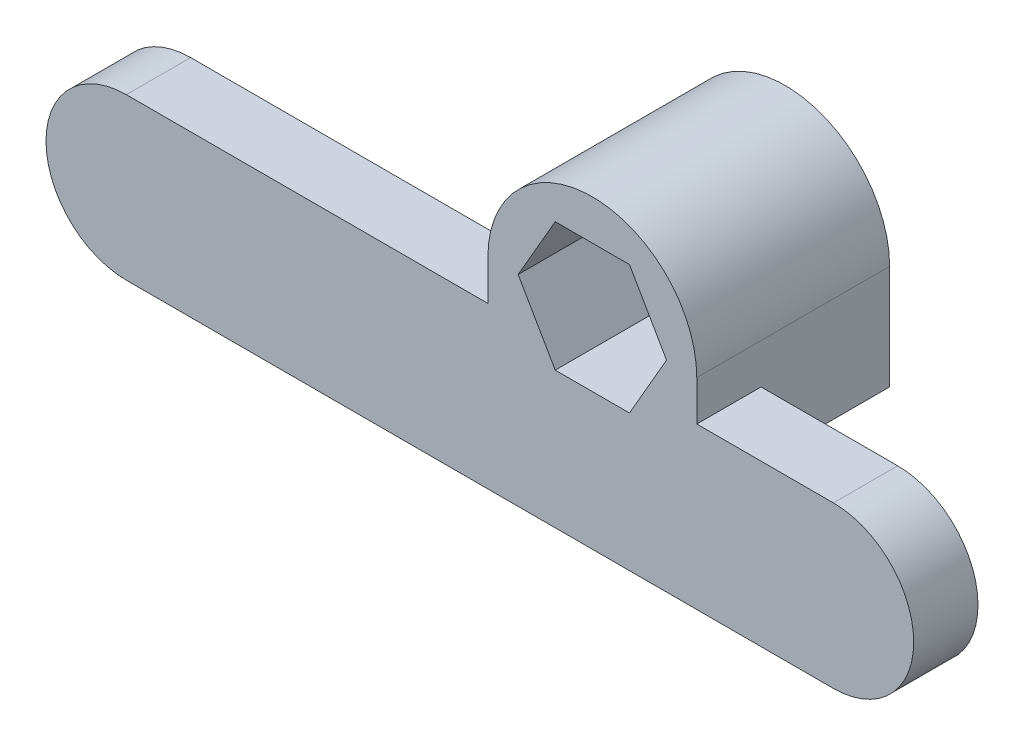
ISO-10303-21;
HEADER;
FILE_DESCRIPTION(('STEP AP214'),'2;1');
FILE_NAME('part.step','',(''),(''),'','','');
FILE_SCHEMA(('AUTOMOTIVE_DESIGN { 1 0 10303 214 1 1 1 1 }'));
ENDSEC;
DATA;
#1=APPLICATION_CONTEXT('core data for automotive mechanical design processes');
#2=APPLICATION_PROTOCOL_DEFINITION('international standard','automotive_design',2000,#1);
#3=PRODUCT_CONTEXT('',#1,'mechanical');
#4=PRODUCT('Part','Part','',(#3));
#5=PRODUCT_RELATED_PRODUCT_CATEGORY('part','',(#4));
#6=PRODUCT_DEFINITION_FORMATION('','',#4);
#7=PRODUCT_DEFINITION_CONTEXT('part definition',#1,'design');
#8=PRODUCT_DEFINITION('design','',#6,#7);
#9=PRODUCT_DEFINITION_SHAPE('','',#8);
#10=(LENGTH_UNIT() NAMED_UNIT(*) SI_UNIT(.MILLI.,.METRE.));
#11=(NAMED_UNIT(*) PLANE_ANGLE_UNIT() SI_UNIT($,.RADIAN.));
#12=(NAMED_UNIT(*) SI_UNIT($,.STERADIAN.) SOLID_ANGLE_UNIT());
#13=UNCERTAINTY_MEASURE_WITH_UNIT(LENGTH_MEASURE(1.E-05),#10,'distance_accuracy_value','');
#14=(GEOMETRIC_REPRESENTATION_CONTEXT(3) GLOBAL_UNCERTAINTY_ASSIGNED_CONTEXT((#13)) GLOBAL_UNIT_ASSIGNED_CONTEXT((#10,
#11,#12)) REPRESENTATION_CONTEXT('',''));
#15=CARTESIAN_POINT('',(0.,0.,0.));
#16=DIRECTION('',(0.,0.,1.));
#17=DIRECTION('',(1.,0.,0.));
#18=AXIS2_PLACEMENT_3D('',#15,#16,#17);
#19=CARTESIAN_POINT('',(0.,0.,6.));
#20=DIRECTION('',(0.,0.,-1.));
#21=DIRECTION('',(-1.,0.,0.));
#22=AXIS2_PLACEMENT_3D('',#19,#20,#21);
#23=CYLINDRICAL_SURFACE('',#22,1.25);
#24=CARTESIAN_POINT('',(0.,0.,2.));
#25=DIRECTION('',(0.,0.,1.));
#26=DIRECTION('',(1.,0.,0.));
#27=AXIS2_PLACEMENT_3D('',#24,#25,#26);
#28=CIRCLE('',#27,1.25);
#29=CARTESIAN_POINT('',(1.25,0.,2.));
#30=VERTEX_POINT('',#29);
#31=EDGE_CURVE('E313',#30,#30,#28,.T.);
#32=ORIENTED_EDGE('',*,*,#31,.F.);
#33=EDGE_LOOP('',(#32));
#34=FACE_BOUND('',#33,.T.);
#35=CARTESIAN_POINT('',(0.,0.,4.));
#36=DIRECTION('',(0.,0.,1.));
#37=DIRECTION('',(1.,0.,0.));
#38=AXIS2_PLACEMENT_3D('',#35,#36,#37);
#39=CIRCLE('',#38,1.25);
#40=CARTESIAN_POINT('',(1.25,0.,4.));
#41=VERTEX_POINT('',#40);
#42=EDGE_CURVE('E96',#41,#41,#39,.T.);
#43=ORIENTED_EDGE('',*,*,#42,.T.);
#44=EDGE_LOOP('',(#43));
#45=FACE_BOUND('',#44,.T.);
#46=ADVANCED_FACE('F92',(#34,#45),#23,.F.);
#47=CARTESIAN_POINT('',(0.,0.,2.));
#48=DIRECTION('',(0.,0.,1.));
#49=DIRECTION('',(1.,0.,0.));
#50=AXIS2_PLACEMENT_3D('',#47,#48,#49);
#51=PLANE('',#50);
#52=DIRECTION('',(0.,-1.,0.));
#53=VECTOR('',#52,1.);
#54=CARTESIAN_POINT('',(-1.05,-3.25,2.));
#55=LINE('',#54,#53);
#56=CARTESIAN_POINT('',(-1.05,-3.25,2.));
#57=VERTEX_POINT('',#56);
#58=CARTESIAN_POINT('',(-1.05,-6.25,2.));
#59=VERTEX_POINT('',#58);
#60=EDGE_CURVE('E331',#57,#59,#55,.T.);
#61=ORIENTED_EDGE('',*,*,#60,.F.);
#62=DIRECTION('',(1.,0.,0.));
#63=VECTOR('',#62,1.);
#64=CARTESIAN_POINT('',(-3.25,-3.25,2.));
#65=LINE('',#64,#63);
#66=CARTESIAN_POINT('',(-3.25,-3.25,2.));
#67=VERTEX_POINT('',#66);
#68=EDGE_CURVE('E336',#67,#57,#65,.T.);
#69=ORIENTED_EDGE('',*,*,#68,.F.);
#70=DIRECTION('',(0.,-1.,0.));
#71=VECTOR('',#70,1.);
#72=CARTESIAN_POINT('',(-3.25,0.,2.));
#73=LINE('',#72,#71);
#74=CARTESIAN_POINT('',(-3.25,0.,2.));
#75=VERTEX_POINT('',#74);
#76=EDGE_CURVE('E361',#75,#67,#73,.T.);
#77=ORIENTED_EDGE('',*,*,#76,.F.);
#78=CARTESIAN_POINT('',(0.,0.,2.));
#79=DIRECTION('',(0.,0.,1.));
#80=DIRECTION('',(1.,0.,0.));
#81=AXIS2_PLACEMENT_3D('',#78,#79,#80);
#82=CIRCLE('',#81,3.25);
#83=CARTESIAN_POINT('',(3.25,0.,2.));
#84=VERTEX_POINT('',#83);
#85=EDGE_CURVE('E359',#84,#75,#82,.T.);
#86=ORIENTED_EDGE('',*,*,#85,.F.);
#87=DIRECTION('',(0.,1.,0.));
#88=VECTOR('',#87,1.);
#89=CARTESIAN_POINT('',(3.25,0.,2.));
#90=LINE('',#89,#88);
#91=CARTESIAN_POINT('',(3.25,-3.25,2.));
#92=VERTEX_POINT('',#91);
#93=EDGE_CURVE('E357',#92,#84,#90,.T.);
#94=ORIENTED_EDGE('',*,*,#93,.F.);
#95=DIRECTION('',(1.,0.,0.));
#96=VECTOR('',#95,1.);
#97=CARTESIAN_POINT('',(1.05,-3.25,2.));
#98=LINE('',#97,#96);
#99=CARTESIAN_POINT('',(1.05,-3.25,2.));
#100=VERTEX_POINT('',#99);
#101=EDGE_CURVE('E355',#100,#92,#98,.T.);
#102=ORIENTED_EDGE('',*,*,#101,.F.);
#103=DIRECTION('',(0.,1.,0.));
#104=VECTOR('',#103,1.);
#105=CARTESIAN_POINT('',(1.05,-3.25,2.));
#106=LINE('',#105,#104);
#107=CARTESIAN_POINT('',(1.05,-6.25,2.));
#108=VERTEX_POINT('',#107);
#109=EDGE_CURVE('E353',#108,#100,#106,.T.);
#110=ORIENTED_EDGE('',*,*,#109,.F.);
#111=DIRECTION('',(1.,0.,0.));
#112=VECTOR('',#111,1.);
#113=CARTESIAN_POINT('',(-1.05,-6.25,2.));
#114=LINE('',#113,#112);
#115=EDGE_CURVE('E351',#59,#108,#114,.T.);
#116=ORIENTED_EDGE('',*,*,#115,.F.);
#117=EDGE_LOOP('',(#61,#69,#77,#86,#94,#102,#110,#116));
#118=FACE_BOUND('',#117,.T.);
#119=ORIENTED_EDGE('',*,*,#31,.T.);
#120=EDGE_LOOP('',(#119));
#121=FACE_BOUND('',#120,.T.);
#122=ADVANCED_FACE('F391',(#118,#121),#51,.F.);
#123=CARTESIAN_POINT('',(-1.05,-3.25,6.));
#124=DIRECTION('',(1.,0.,0.));
#125=DIRECTION('',(0.,1.,0.));
#126=AXIS2_PLACEMENT_3D('',#123,#124,#125);
#127=PLANE('',#126);
#128=ORIENTED_EDGE('',*,*,#60,.T.);
#129=DIRECTION('',(0.,0.,-1.));
#130=VECTOR('',#129,1.);
#131=CARTESIAN_POINT('',(-1.05,-6.25,6.));
#132=LINE('',#131,#130);
#133=CARTESIAN_POINT('',(-1.05,-6.25,6.));
#134=VERTEX_POINT('',#133);
#135=EDGE_CURVE('E13',#134,#59,#132,.T.);
#136=ORIENTED_EDGE('',*,*,#135,.F.);
#137=DIRECTION('',(0.,-1.,0.));
#138=VECTOR('',#137,1.);
#139=CARTESIAN_POINT('',(-1.05,-3.25,6.));
#140=LINE('',#139,#138);
#141=CARTESIAN_POINT('',(-1.05,-3.25,6.));
#142=VERTEX_POINT('',#141);
#143=EDGE_CURVE('E332',#142,#134,#140,.T.);
#144=ORIENTED_EDGE('',*,*,#143,.F.);
#145=DIRECTION('',(0.,0.,-1.));
#146=VECTOR('',#145,1.);
#147=CARTESIAN_POINT('',(-1.05,-3.25,6.));
#148=LINE('',#147,#146);
#149=EDGE_CURVE('E348',#142,#57,#148,.T.);
#150=ORIENTED_EDGE('',*,*,#149,.T.);
#151=EDGE_LOOP('',(#128,#136,#144,#150));
#152=FACE_BOUND('',#151,.T.);
#153=ADVANCED_FACE('F94',(#152),#127,.F.);
#154=CARTESIAN_POINT('',(-1.05,-6.25,6.));
#155=DIRECTION('',(0.,1.,0.));
#156=DIRECTION('',(0.,0.,1.));
#157=AXIS2_PLACEMENT_3D('',#154,#155,#156);
#158=PLANE('',#157);
#159=ORIENTED_EDGE('',*,*,#115,.T.);
#160=DIRECTION('',(0.,0.,-1.));
#161=VECTOR('',#160,1.);
#162=CARTESIAN_POINT('',(1.05,-6.25,6.));
#163=LINE('',#162,#161);
#164=CARTESIAN_POINT('',(1.05,-6.25,6.));
#165=VERTEX_POINT('',#164);
#166=EDGE_CURVE('E101',#165,#108,#163,.T.);
#167=ORIENTED_EDGE('',*,*,#166,.F.);
#168=DIRECTION('',(1.,0.,0.));
#169=VECTOR('',#168,1.);
#170=CARTESIAN_POINT('',(0.,-6.25,6.));
#171=LINE('',#170,#169);
#172=CARTESIAN_POINT('',(7.5,-6.25,6.));
#173=VERTEX_POINT('',#172);
#174=EDGE_CURVE('E297',#165,#173,#171,.T.);
#175=ORIENTED_EDGE('',*,*,#174,.T.);
#176=DIRECTION('',(0.,0.,-1.));
#177=VECTOR('',#176,1.);
#178=CARTESIAN_POINT('',(7.5,-6.25,8.));
#179=LINE('',#178,#177);
#180=CARTESIAN_POINT('',(7.5,-6.25,8.));
#181=VERTEX_POINT('',#180);
#182=EDGE_CURVE('E305',#181,#173,#179,.T.);
#183=ORIENTED_EDGE('',*,*,#182,.F.);
#184=DIRECTION('',(1.,0.,0.));
#185=VECTOR('',#184,1.);
#186=CARTESIAN_POINT('',(0.,-6.25,8.));
#187=LINE('',#186,#185);
#188=CARTESIAN_POINT('',(-14.5,-6.25,8.));
#189=VERTEX_POINT('',#188);
#190=EDGE_CURVE('E289',#189,#181,#187,.T.);
#191=ORIENTED_EDGE('',*,*,#190,.F.);
#192=DIRECTION('',(0.,0.,-1.));
#193=VECTOR('',#192,1.);
#194=CARTESIAN_POINT('',(-14.5,-6.25,8.));
#195=LINE('',#194,#193);
#196=CARTESIAN_POINT('',(-14.5,-6.25,6.));
#197=VERTEX_POINT('',#196);
#198=EDGE_CURVE('E320',#189,#197,#195,.T.);
#199=ORIENTED_EDGE('',*,*,#198,.T.);
#200=EDGE_CURVE('E299',#197,#134,#171,.T.);
#201=ORIENTED_EDGE('',*,*,#200,.T.);
#202=ORIENTED_EDGE('',*,*,#135,.T.);
#203=EDGE_LOOP('',(#159,#167,#175,#183,#191,#199,#201,#202));
#204=FACE_BOUND('',#203,.T.);
#205=ADVANCED_FACE('F407',(#204),#158,.F.);
#206=CARTESIAN_POINT('',(1.05,-3.25,6.));
#207=DIRECTION('',(-1.,0.,0.));
#208=DIRECTION('',(0.,-1.,0.));
#209=AXIS2_PLACEMENT_3D('',#206,#207,#208);
#210=PLANE('',#209);
#211=ORIENTED_EDGE('',*,*,#109,.T.);
#212=DIRECTION('',(0.,0.,-1.));
#213=VECTOR('',#212,1.);
#214=CARTESIAN_POINT('',(1.05,-3.25,6.));
#215=LINE('',#214,#213);
#216=CARTESIAN_POINT('',(1.05,-3.25,6.));
#217=VERTEX_POINT('',#216);
#218=EDGE_CURVE('E378',#217,#100,#215,.T.);
#219=ORIENTED_EDGE('',*,*,#218,.F.);
#220=DIRECTION('',(0.,1.,0.));
#221=VECTOR('',#220,1.);
#222=CARTESIAN_POINT('',(1.05,-3.25,6.));
#223=LINE('',#222,#221);
#224=EDGE_CURVE('E335',#165,#217,#223,.T.);
#225=ORIENTED_EDGE('',*,*,#224,.F.);
#226=ORIENTED_EDGE('',*,*,#166,.T.);
#227=EDGE_LOOP('',(#211,#219,#225,#226));
#228=FACE_BOUND('',#227,.T.);
#229=ADVANCED_FACE('F385',(#228),#210,.F.);
#230=CARTESIAN_POINT('',(1.05,-3.25,6.));
#231=DIRECTION('',(0.,1.,0.));
#232=DIRECTION('',(0.,0.,1.));
#233=AXIS2_PLACEMENT_3D('',#230,#231,#232);
#234=PLANE('',#233);
#235=ORIENTED_EDGE('',*,*,#101,.T.);
#236=DIRECTION('',(0.,0.,-1.));
#237=VECTOR('',#236,1.);
#238=CARTESIAN_POINT('',(3.25,-3.25,6.));
#239=LINE('',#238,#237);
#240=CARTESIAN_POINT('',(3.25,-3.25,6.));
#241=VERTEX_POINT('',#240);
#242=EDGE_CURVE('E375',#241,#92,#239,.T.);
#243=ORIENTED_EDGE('',*,*,#242,.F.);
#244=DIRECTION('',(1.,0.,0.));
#245=VECTOR('',#244,1.);
#246=CARTESIAN_POINT('',(1.05,-3.25,6.));
#247=LINE('',#246,#245);
#248=EDGE_CURVE('E339',#217,#241,#247,.T.);
#249=ORIENTED_EDGE('',*,*,#248,.F.);
#250=ORIENTED_EDGE('',*,*,#218,.T.);
#251=EDGE_LOOP('',(#235,#243,#249,#250));
#252=FACE_BOUND('',#251,.T.);
#253=ADVANCED_FACE('F396',(#252),#234,.F.);
#254=CARTESIAN_POINT('',(3.25,0.,6.));
#255=DIRECTION('',(-1.,0.,0.));
#256=DIRECTION('',(0.,0.,1.));
#257=AXIS2_PLACEMENT_3D('',#254,#255,#256);
#258=PLANE('',#257);
#259=ORIENTED_EDGE('',*,*,#93,.T.);
#260=DIRECTION('',(0.,0.,-1.));
#261=VECTOR('',#260,1.);
#262=CARTESIAN_POINT('',(3.25,0.,6.));
#263=LINE('',#262,#261);
#264=CARTESIAN_POINT('',(3.25,0.,8.));
#265=VERTEX_POINT('',#264);
#266=EDGE_CURVE('E372',#265,#84,#263,.T.);
#267=ORIENTED_EDGE('',*,*,#266,.F.);
#268=DIRECTION('',(0.,1.,0.));
#269=VECTOR('',#268,1.);
#270=CARTESIAN_POINT('',(3.25,0.,8.));
#271=LINE('',#270,#269);
#272=CARTESIAN_POINT('',(3.25,-1.25,8.));
#273=VERTEX_POINT('',#272);
#274=EDGE_CURVE('E279',#273,#265,#271,.T.);
#275=ORIENTED_EDGE('',*,*,#274,.F.);
#276=DIRECTION('',(0.,0.,-1.));
#277=VECTOR('',#276,1.);
#278=CARTESIAN_POINT('',(3.25,-1.25,8.));
#279=LINE('',#278,#277);
#280=CARTESIAN_POINT('',(3.25,-1.25,6.));
#281=VERTEX_POINT('',#280);
#282=EDGE_CURVE('E308',#273,#281,#279,.T.);
#283=ORIENTED_EDGE('',*,*,#282,.T.);
#284=DIRECTION('',(0.,1.,0.));
#285=VECTOR('',#284,1.);
#286=CARTESIAN_POINT('',(3.25,0.,6.));
#287=LINE('',#286,#285);
#288=EDGE_CURVE('E342',#241,#281,#287,.T.);
#289=ORIENTED_EDGE('',*,*,#288,.F.);
#290=ORIENTED_EDGE('',*,*,#242,.T.);
#291=EDGE_LOOP('',(#259,#267,#275,#283,#289,#290));
#292=FACE_BOUND('',#291,.T.);
#293=ADVANCED_FACE('F400',(#292),#258,.F.);
#294=CARTESIAN_POINT('',(0.,0.,6.));
#295=DIRECTION('',(0.,0.,-1.));
#296=DIRECTION('',(-1.,0.,0.));
#297=AXIS2_PLACEMENT_3D('',#294,#295,#296);
#298=CYLINDRICAL_SURFACE('',#297,3.25);
#299=ORIENTED_EDGE('',*,*,#85,.T.);
#300=DIRECTION('',(0.,0.,-1.));
#301=VECTOR('',#300,1.);
#302=CARTESIAN_POINT('',(-3.25,0.,6.));
#303=LINE('',#302,#301);
#304=CARTESIAN_POINT('',(-3.25,0.,8.));
#305=VERTEX_POINT('',#304);
#306=EDGE_CURVE('E369',#305,#75,#303,.T.);
#307=ORIENTED_EDGE('',*,*,#306,.F.);
#308=CARTESIAN_POINT('',(0.,0.,8.));
#309=DIRECTION('',(0.,0.,1.));
#310=DIRECTION('',(1.,0.,0.));
#311=AXIS2_PLACEMENT_3D('',#308,#309,#310);
#312=CIRCLE('',#311,3.25);
#313=EDGE_CURVE('E283',#265,#305,#312,.T.);
#314=ORIENTED_EDGE('',*,*,#313,.F.);
#315=ORIENTED_EDGE('',*,*,#266,.T.);
#316=EDGE_LOOP('',(#299,#307,#314,#315));
#317=FACE_BOUND('',#316,.T.);
#318=ADVANCED_FACE('F433',(#317),#298,.T.);
#319=CARTESIAN_POINT('',(-3.25,0.,6.));
#320=DIRECTION('',(1.,0.,0.));
#321=DIRECTION('',(0.,1.,0.));
#322=AXIS2_PLACEMENT_3D('',#319,#320,#321);
#323=PLANE('',#322);
#324=ORIENTED_EDGE('',*,*,#76,.T.);
#325=DIRECTION('',(0.,0.,-1.));
#326=VECTOR('',#325,1.);
#327=CARTESIAN_POINT('',(-3.25,-3.25,6.));
#328=LINE('',#327,#326);
#329=CARTESIAN_POINT('',(-3.25,-3.25,6.));
#330=VERTEX_POINT('',#329);
#331=EDGE_CURVE('E366',#330,#67,#328,.T.);
#332=ORIENTED_EDGE('',*,*,#331,.F.);
#333=DIRECTION('',(0.,-1.,0.));
#334=VECTOR('',#333,1.);
#335=CARTESIAN_POINT('',(-3.25,0.,6.));
#336=LINE('',#335,#334);
#337=CARTESIAN_POINT('',(-3.25,-1.25,6.));
#338=VERTEX_POINT('',#337);
#339=EDGE_CURVE('E116',#338,#330,#336,.T.);
#340=ORIENTED_EDGE('',*,*,#339,.F.);
#341=DIRECTION('',(0.,0.,-1.));
#342=VECTOR('',#341,1.);
#343=CARTESIAN_POINT('',(-3.25,-1.25,8.));
#344=LINE('',#343,#342);
#345=CARTESIAN_POINT('',(-3.25,-1.25,8.));
#346=VERTEX_POINT('',#345);
#347=EDGE_CURVE('E311',#346,#338,#344,.T.);
#348=ORIENTED_EDGE('',*,*,#347,.F.);
#349=DIRECTION('',(0.,-1.,0.));
#350=VECTOR('',#349,1.);
#351=CARTESIAN_POINT('',(-3.25,0.,8.));
#352=LINE('',#351,#350);
#353=EDGE_CURVE('E286',#305,#346,#352,.T.);
#354=ORIENTED_EDGE('',*,*,#353,.F.);
#355=ORIENTED_EDGE('',*,*,#306,.T.);
#356=EDGE_LOOP('',(#324,#332,#340,#348,#354,#355));
#357=FACE_BOUND('',#356,.T.);
#358=ADVANCED_FACE('F429',(#357),#323,.F.);
#359=CARTESIAN_POINT('',(-3.25,-3.25,6.));
#360=DIRECTION('',(0.,1.,0.));
#361=DIRECTION('',(0.,0.,1.));
#362=AXIS2_PLACEMENT_3D('',#359,#360,#361);
#363=PLANE('',#362);
#364=ORIENTED_EDGE('',*,*,#68,.T.);
#365=ORIENTED_EDGE('',*,*,#149,.F.);
#366=DIRECTION('',(1.,0.,0.));
#367=VECTOR('',#366,1.);
#368=CARTESIAN_POINT('',(-3.25,-3.25,6.));
#369=LINE('',#368,#367);
#370=EDGE_CURVE('E345',#330,#142,#369,.T.);
#371=ORIENTED_EDGE('',*,*,#370,.F.);
#372=ORIENTED_EDGE('',*,*,#331,.T.);
#373=EDGE_LOOP('',(#364,#365,#371,#372));
#374=FACE_BOUND('',#373,.T.);
#375=ADVANCED_FACE('F426',(#374),#363,.F.);
#376=CARTESIAN_POINT('',(0.,0.,6.));
#377=DIRECTION('',(0.,0.,1.));
#378=DIRECTION('',(1.,0.,0.));
#379=AXIS2_PLACEMENT_3D('',#376,#377,#378);
#380=PLANE('',#379);
#381=ORIENTED_EDGE('',*,*,#174,.F.);
#382=ORIENTED_EDGE('',*,*,#224,.T.);
#383=ORIENTED_EDGE('',*,*,#248,.T.);
#384=ORIENTED_EDGE('',*,*,#288,.T.);
#385=DIRECTION('',(-1.,0.,0.));
#386=VECTOR('',#385,1.);
#387=CARTESIAN_POINT('',(0.,-1.25,6.));
#388=LINE('',#387,#386);
#389=CARTESIAN_POINT('',(7.5,-1.25,6.));
#390=VERTEX_POINT('',#389);
#391=EDGE_CURVE('E294',#390,#281,#388,.T.);
#392=ORIENTED_EDGE('',*,*,#391,.F.);
#393=CARTESIAN_POINT('',(7.5,-3.75,6.));
#394=DIRECTION('',(0.,0.,1.));
#395=DIRECTION('',(1.,0.,0.));
#396=AXIS2_PLACEMENT_3D('',#393,#394,#395);
#397=CIRCLE('',#396,2.5);
#398=EDGE_CURVE('E280',#173,#390,#397,.T.);
#399=ORIENTED_EDGE('',*,*,#398,.F.);
#400=EDGE_LOOP('',(#381,#382,#383,#384,#392,#399));
#401=FACE_BOUND('',#400,.T.);
#402=ADVANCED_FACE('F404',(#401),#380,.F.);
#403=ORIENTED_EDGE('',*,*,#370,.T.);
#404=ORIENTED_EDGE('',*,*,#143,.T.);
#405=ORIENTED_EDGE('',*,*,#200,.F.);
#406=CARTESIAN_POINT('',(-14.5,-3.75,6.));
#407=DIRECTION('',(0.,0.,1.));
#408=DIRECTION('',(1.,0.,0.));
#409=AXIS2_PLACEMENT_3D('',#406,#407,#408);
#410=CIRCLE('',#409,2.5);
#411=CARTESIAN_POINT('',(-14.5,-1.25,6.));
#412=VERTEX_POINT('',#411);
#413=EDGE_CURVE('E317',#412,#197,#410,.T.);
#414=ORIENTED_EDGE('',*,*,#413,.F.);
#415=DIRECTION('',(-1.,0.,0.));
#416=VECTOR('',#415,1.);
#417=CARTESIAN_POINT('',(-3.25,-1.25,6.));
#418=LINE('',#417,#416);
#419=EDGE_CURVE('E321',#338,#412,#418,.T.);
#420=ORIENTED_EDGE('',*,*,#419,.F.);
#421=ORIENTED_EDGE('',*,*,#339,.T.);
#422=EDGE_LOOP('',(#403,#404,#405,#414,#420,#421));
#423=FACE_BOUND('',#422,.T.);
#424=ADVANCED_FACE('F421',(#423),#380,.F.);
#425=CARTESIAN_POINT('',(0.,-1.25,8.));
#426=DIRECTION('',(0.,-1.,0.));
#427=DIRECTION('',(1.,0.,0.));
#428=AXIS2_PLACEMENT_3D('',#425,#426,#427);
#429=PLANE('',#428);
#430=ORIENTED_EDGE('',*,*,#391,.T.);
#431=ORIENTED_EDGE('',*,*,#282,.F.);
#432=DIRECTION('',(-1.,0.,0.));
#433=VECTOR('',#432,1.);
#434=CARTESIAN_POINT('',(0.,-1.25,8.));
#435=LINE('',#434,#433);
#436=CARTESIAN_POINT('',(7.5,-1.25,8.));
#437=VERTEX_POINT('',#436);
#438=EDGE_CURVE('E276',#437,#273,#435,.T.);
#439=ORIENTED_EDGE('',*,*,#438,.F.);
#440=DIRECTION('',(0.,0.,-1.));
#441=VECTOR('',#440,1.);
#442=CARTESIAN_POINT('',(7.5,-1.25,8.));
#443=LINE('',#442,#441);
#444=EDGE_CURVE('E293',#437,#390,#443,.T.);
#445=ORIENTED_EDGE('',*,*,#444,.T.);
#446=EDGE_LOOP('',(#430,#431,#439,#445));
#447=FACE_BOUND('',#446,.T.);
#448=ADVANCED_FACE('F570',(#447),#429,.F.);
#449=CARTESIAN_POINT('',(7.5,-3.75,8.));
#450=DIRECTION('',(0.,0.,-1.));
#451=DIRECTION('',(-1.,0.,0.));
#452=AXIS2_PLACEMENT_3D('',#449,#450,#451);
#453=CYLINDRICAL_SURFACE('',#452,2.5);
#454=ORIENTED_EDGE('',*,*,#398,.T.);
#455=ORIENTED_EDGE('',*,*,#444,.F.);
#456=CARTESIAN_POINT('',(7.5,-3.75,8.));
#457=DIRECTION('',(0.,0.,1.));
#458=DIRECTION('',(1.,0.,0.));
#459=AXIS2_PLACEMENT_3D('',#456,#457,#458);
#460=CIRCLE('',#459,2.5);
#461=EDGE_CURVE('E291',#181,#437,#460,.T.);
#462=ORIENTED_EDGE('',*,*,#461,.F.);
#463=ORIENTED_EDGE('',*,*,#182,.T.);
#464=EDGE_LOOP('',(#454,#455,#462,#463));
#465=FACE_BOUND('',#464,.T.);
#466=ADVANCED_FACE('F410',(#465),#453,.T.);
#467=CARTESIAN_POINT('',(0.,0.,8.));
#468=DIRECTION('',(0.,0.,1.));
#469=DIRECTION('',(1.,0.,0.));
#470=AXIS2_PLACEMENT_3D('',#467,#468,#469);
#471=PLANE('',#470);
#472=DIRECTION('',(-0.5,0.866025403784438,0.));
#473=VECTOR('',#472,1.);
#474=CARTESIAN_POINT('',(2.3094010767585,0.,8.));
#475=LINE('',#474,#473);
#476=CARTESIAN_POINT('',(2.3094010767585,0.,8.));
#477=VERTEX_POINT('',#476);
#478=CARTESIAN_POINT('',(1.15470053837925,2.,8.));
#479=VERTEX_POINT('',#478);
#480=EDGE_CURVE('E108',#477,#479,#475,.T.);
#481=ORIENTED_EDGE('',*,*,#480,.F.);
#482=DIRECTION('',(0.5,0.866025403784439,0.));
#483=VECTOR('',#482,1.);
#484=CARTESIAN_POINT('',(1.15470053837925,-2.,8.));
#485=LINE('',#484,#483);
#486=CARTESIAN_POINT('',(1.15470053837925,-2.,8.));
#487=VERTEX_POINT('',#486);
#488=EDGE_CURVE('E262',#487,#477,#485,.T.);
#489=ORIENTED_EDGE('',*,*,#488,.F.);
#490=DIRECTION('',(1.,0.,0.));
#491=VECTOR('',#490,1.);
#492=CARTESIAN_POINT('',(-1.15470053837925,-2.,8.));
#493=LINE('',#492,#491);
#494=CARTESIAN_POINT('',(-1.15470053837925,-2.,8.));
#495=VERTEX_POINT('',#494);
#496=EDGE_CURVE('E256',#495,#487,#493,.T.);
#497=ORIENTED_EDGE('',*,*,#496,.F.);
#498=DIRECTION('',(0.5,-0.866025403784438,0.));
#499=VECTOR('',#498,1.);
#500=CARTESIAN_POINT('',(-2.3094010767585,0.,8.));
#501=LINE('',#500,#499);
#502=CARTESIAN_POINT('',(-2.3094010767585,0.,8.));
#503=VERTEX_POINT('',#502);
#504=EDGE_CURVE('E254',#503,#495,#501,.T.);
#505=ORIENTED_EDGE('',*,*,#504,.F.);
#506=DIRECTION('',(-0.5,-0.866025403784439,0.));
#507=VECTOR('',#506,1.);
#508=CARTESIAN_POINT('',(-1.15470053837925,2.,8.));
#509=LINE('',#508,#507);
#510=CARTESIAN_POINT('',(-1.15470053837925,2.,8.));
#511=VERTEX_POINT('',#510);
#512=EDGE_CURVE('E236',#511,#503,#509,.T.);
#513=ORIENTED_EDGE('',*,*,#512,.F.);
#514=DIRECTION('',(-1.,0.,0.));
#515=VECTOR('',#514,1.);
#516=CARTESIAN_POINT('',(1.15470053837925,2.,8.));
#517=LINE('',#516,#515);
#518=EDGE_CURVE('E246',#479,#511,#517,.T.);
#519=ORIENTED_EDGE('',*,*,#518,.F.);
#520=EDGE_LOOP('',(#481,#489,#497,#505,#513,#519));
#521=FACE_BOUND('',#520,.T.);
#522=ORIENTED_EDGE('',*,*,#438,.T.);
#523=ORIENTED_EDGE('',*,*,#274,.T.);
#524=ORIENTED_EDGE('',*,*,#313,.T.);
#525=ORIENTED_EDGE('',*,*,#353,.T.);
#526=DIRECTION('',(-1.,0.,0.));
#527=VECTOR('',#526,1.);
#528=CARTESIAN_POINT('',(-3.25,-1.25,8.));
#529=LINE('',#528,#527);
#530=CARTESIAN_POINT('',(-14.5,-1.25,8.));
#531=VERTEX_POINT('',#530);
#532=EDGE_CURVE('E314',#346,#531,#529,.T.);
#533=ORIENTED_EDGE('',*,*,#532,.T.);
#534=CARTESIAN_POINT('',(-14.5,-3.75,8.));
#535=DIRECTION('',(0.,0.,1.));
#536=DIRECTION('',(1.,0.,0.));
#537=AXIS2_PLACEMENT_3D('',#534,#535,#536);
#538=CIRCLE('',#537,2.5);
#539=EDGE_CURVE('E316',#531,#189,#538,.T.);
#540=ORIENTED_EDGE('',*,*,#539,.T.);
#541=ORIENTED_EDGE('',*,*,#190,.T.);
#542=ORIENTED_EDGE('',*,*,#461,.T.);
#543=EDGE_LOOP('',(#522,#523,#524,#525,#533,#540,#541,#542));
#544=FACE_BOUND('',#543,.T.);
#545=ADVANCED_FACE('F250',(#521,#544),#471,.T.);
#546=CARTESIAN_POINT('',(-14.5,-3.75,8.));
#547=DIRECTION('',(0.,0.,-1.));
#548=DIRECTION('',(-1.,0.,0.));
#549=AXIS2_PLACEMENT_3D('',#546,#547,#548);
#550=CYLINDRICAL_SURFACE('',#549,2.5);
#551=ORIENTED_EDGE('',*,*,#413,.T.);
#552=ORIENTED_EDGE('',*,*,#198,.F.);
#553=ORIENTED_EDGE('',*,*,#539,.F.);
#554=DIRECTION('',(0.,0.,-1.));
#555=VECTOR('',#554,1.);
#556=CARTESIAN_POINT('',(-14.5,-1.25,8.));
#557=LINE('',#556,#555);
#558=EDGE_CURVE('E298',#531,#412,#557,.T.);
#559=ORIENTED_EDGE('',*,*,#558,.T.);
#560=EDGE_LOOP('',(#551,#552,#553,#559));
#561=FACE_BOUND('',#560,.T.);
#562=ADVANCED_FACE('F416',(#561),#550,.T.);
#563=CARTESIAN_POINT('',(-3.25,-1.25,8.));
#564=DIRECTION('',(0.,-1.,0.));
#565=DIRECTION('',(1.,0.,0.));
#566=AXIS2_PLACEMENT_3D('',#563,#564,#565);
#567=PLANE('',#566);
#568=ORIENTED_EDGE('',*,*,#419,.T.);
#569=ORIENTED_EDGE('',*,*,#558,.F.);
#570=ORIENTED_EDGE('',*,*,#532,.F.);
#571=ORIENTED_EDGE('',*,*,#347,.T.);
#572=EDGE_LOOP('',(#568,#569,#570,#571));
#573=FACE_BOUND('',#572,.T.);
#574=ADVANCED_FACE('F436',(#573),#567,.F.);
#575=CARTESIAN_POINT('',(2.3094010767585,0.,-4.11010092660779));
#576=DIRECTION('',(0.866025403784438,0.5,0.));
#577=DIRECTION('',(-0.5,0.866025403784439,0.));
#578=AXIS2_PLACEMENT_3D('',#575,#576,#577);
#579=PLANE('',#578);
#580=DIRECTION('',(0.5,-0.866025403784439,0.));
#581=VECTOR('',#580,1.);
#582=CARTESIAN_POINT('',(2.3094010767585,0.,4.));
#583=LINE('',#582,#581);
#584=CARTESIAN_POINT('',(1.15470053837925,2.,4.));
#585=VERTEX_POINT('',#584);
#586=CARTESIAN_POINT('',(2.3094010767585,0.,4.));
#587=VERTEX_POINT('',#586);
#588=EDGE_CURVE('E275',#585,#587,#583,.T.);
#589=ORIENTED_EDGE('',*,*,#588,.T.);
#590=DIRECTION('',(0.,0.,1.));
#591=VECTOR('',#590,1.);
#592=CARTESIAN_POINT('',(2.3094010767585,0.,-4.11010092660779));
#593=LINE('',#592,#591);
#594=EDGE_CURVE('E265',#587,#477,#593,.T.);
#595=ORIENTED_EDGE('',*,*,#594,.T.);
#596=ORIENTED_EDGE('',*,*,#480,.T.);
#597=DIRECTION('',(0.,0.,1.));
#598=VECTOR('',#597,1.);
#599=CARTESIAN_POINT('',(1.15470053837925,2.,-4.11010092660779));
#600=LINE('',#599,#598);
#601=EDGE_CURVE('E243',#585,#479,#600,.T.);
#602=ORIENTED_EDGE('',*,*,#601,.F.);
#603=EDGE_LOOP('',(#589,#595,#596,#602));
#604=FACE_BOUND('',#603,.T.);
#605=ADVANCED_FACE('F438',(#604),#579,.F.);
#606=CARTESIAN_POINT('',(1.15470053837925,-2.,-4.11010092660779));
#607=DIRECTION('',(0.866025403784439,-0.5,0.));
#608=DIRECTION('',(0.5,0.866025403784439,0.));
#609=AXIS2_PLACEMENT_3D('',#606,#607,#608);
#610=PLANE('',#609);
#611=DIRECTION('',(-0.5,-0.866025403784439,0.));
#612=VECTOR('',#611,1.);
#613=CARTESIAN_POINT('',(1.15470053837925,-2.,4.));
#614=LINE('',#613,#612);
#615=CARTESIAN_POINT('',(1.15470053837925,-2.,4.));
#616=VERTEX_POINT('',#615);
#617=EDGE_CURVE('E701',#587,#616,#614,.T.);
#618=ORIENTED_EDGE('',*,*,#617,.T.);
#619=DIRECTION('',(0.,0.,1.));
#620=VECTOR('',#619,1.);
#621=CARTESIAN_POINT('',(1.15470053837925,-2.,-4.11010092660779));
#622=LINE('',#621,#620);
#623=EDGE_CURVE('E267',#616,#487,#622,.T.);
#624=ORIENTED_EDGE('',*,*,#623,.T.);
#625=ORIENTED_EDGE('',*,*,#488,.T.);
#626=ORIENTED_EDGE('',*,*,#594,.F.);
#627=EDGE_LOOP('',(#618,#624,#625,#626));
#628=FACE_BOUND('',#627,.T.);
#629=ADVANCED_FACE('F444',(#628),#610,.F.);
#630=CARTESIAN_POINT('',(-1.15470053837925,-2.,-4.11010092660779));
#631=DIRECTION('',(0.,-1.,0.));
#632=DIRECTION('',(1.,0.,0.));
#633=AXIS2_PLACEMENT_3D('',#630,#631,#632);
#634=PLANE('',#633);
#635=DIRECTION('',(-1.,0.,0.));
#636=VECTOR('',#635,1.);
#637=CARTESIAN_POINT('',(-1.15470053837925,-2.,4.));
#638=LINE('',#637,#636);
#639=CARTESIAN_POINT('',(-1.15470053837925,-2.,4.));
#640=VERTEX_POINT('',#639);
#641=EDGE_CURVE('E704',#616,#640,#638,.T.);
#642=ORIENTED_EDGE('',*,*,#641,.T.);
#643=DIRECTION('',(0.,0.,1.));
#644=VECTOR('',#643,1.);
#645=CARTESIAN_POINT('',(-1.15470053837925,-2.,-4.11010092660779));
#646=LINE('',#645,#644);
#647=EDGE_CURVE('E269',#640,#495,#646,.T.);
#648=ORIENTED_EDGE('',*,*,#647,.T.);
#649=ORIENTED_EDGE('',*,*,#496,.T.);
#650=ORIENTED_EDGE('',*,*,#623,.F.);
#651=EDGE_LOOP('',(#642,#648,#649,#650));
#652=FACE_BOUND('',#651,.T.);
#653=ADVANCED_FACE('F632',(#652),#634,.F.);
#654=CARTESIAN_POINT('',(-2.3094010767585,0.,-4.11010092660779));
#655=DIRECTION('',(-0.866025403784438,-0.5,0.));
#656=DIRECTION('',(0.5,-0.866025403784438,0.));
#657=AXIS2_PLACEMENT_3D('',#654,#655,#656);
#658=PLANE('',#657);
#659=DIRECTION('',(-0.5,0.866025403784438,0.));
#660=VECTOR('',#659,1.);
#661=CARTESIAN_POINT('',(-2.3094010767585,0.,4.));
#662=LINE('',#661,#660);
#663=CARTESIAN_POINT('',(-2.3094010767585,0.,4.));
#664=VERTEX_POINT('',#663);
#665=EDGE_CURVE('E708',#640,#664,#662,.T.);
#666=ORIENTED_EDGE('',*,*,#665,.T.);
#667=DIRECTION('',(0.,0.,1.));
#668=VECTOR('',#667,1.);
#669=CARTESIAN_POINT('',(-2.3094010767585,0.,-4.11010092660779));
#670=LINE('',#669,#668);
#671=EDGE_CURVE('E242',#664,#503,#670,.T.);
#672=ORIENTED_EDGE('',*,*,#671,.T.);
#673=ORIENTED_EDGE('',*,*,#504,.T.);
#674=ORIENTED_EDGE('',*,*,#647,.F.);
#675=EDGE_LOOP('',(#666,#672,#673,#674));
#676=FACE_BOUND('',#675,.T.);
#677=ADVANCED_FACE('F643',(#676),#658,.F.);
#678=CARTESIAN_POINT('',(-1.15470053837925,2.,-4.11010092660779));
#679=DIRECTION('',(-0.866025403784439,0.5,0.));
#680=DIRECTION('',(-0.5,-0.866025403784439,0.));
#681=AXIS2_PLACEMENT_3D('',#678,#679,#680);
#682=PLANE('',#681);
#683=DIRECTION('',(0.5,0.866025403784439,0.));
#684=VECTOR('',#683,1.);
#685=CARTESIAN_POINT('',(-1.15470053837925,2.,4.));
#686=LINE('',#685,#684);
#687=CARTESIAN_POINT('',(-1.15470053837925,2.,4.));
#688=VERTEX_POINT('',#687);
#689=EDGE_CURVE('E239',#664,#688,#686,.T.);
#690=ORIENTED_EDGE('',*,*,#689,.T.);
#691=DIRECTION('',(0.,0.,1.));
#692=VECTOR('',#691,1.);
#693=CARTESIAN_POINT('',(-1.15470053837925,2.,-4.11010092660779));
#694=LINE('',#693,#692);
#695=EDGE_CURVE('E231',#688,#511,#694,.T.);
#696=ORIENTED_EDGE('',*,*,#695,.T.);
#697=ORIENTED_EDGE('',*,*,#512,.T.);
#698=ORIENTED_EDGE('',*,*,#671,.F.);
#699=EDGE_LOOP('',(#690,#696,#697,#698));
#700=FACE_BOUND('',#699,.T.);
#701=ADVANCED_FACE('F233',(#700),#682,.F.);
#702=CARTESIAN_POINT('',(1.15470053837925,2.,-4.11010092660779));
#703=DIRECTION('',(0.,1.,0.));
#704=DIRECTION('',(0.,0.,1.));
#705=AXIS2_PLACEMENT_3D('',#702,#703,#704);
#706=PLANE('',#705);
#707=DIRECTION('',(1.,0.,0.));
#708=VECTOR('',#707,1.);
#709=CARTESIAN_POINT('',(1.15470053837925,2.,4.));
#710=LINE('',#709,#708);
#711=EDGE_CURVE('E273',#688,#585,#710,.T.);
#712=ORIENTED_EDGE('',*,*,#711,.T.);
#713=ORIENTED_EDGE('',*,*,#601,.T.);
#714=ORIENTED_EDGE('',*,*,#518,.T.);
#715=ORIENTED_EDGE('',*,*,#695,.F.);
#716=EDGE_LOOP('',(#712,#713,#714,#715));
#717=FACE_BOUND('',#716,.T.);
#718=ADVANCED_FACE('F247',(#717),#706,.F.);
#719=CARTESIAN_POINT('',(0.,0.,4.));
#720=DIRECTION('',(0.,0.,1.));
#721=DIRECTION('',(1.,0.,0.));
#722=AXIS2_PLACEMENT_3D('',#719,#720,#721);
#723=PLANE('',#722);
#724=ORIENTED_EDGE('',*,*,#42,.F.);
#725=EDGE_LOOP('',(#724));
#726=FACE_BOUND('',#725,.T.);
#727=ORIENTED_EDGE('',*,*,#588,.F.);
#728=ORIENTED_EDGE('',*,*,#711,.F.);
#729=ORIENTED_EDGE('',*,*,#689,.F.);
#730=ORIENTED_EDGE('',*,*,#665,.F.);
#731=ORIENTED_EDGE('',*,*,#641,.F.);
#732=ORIENTED_EDGE('',*,*,#617,.F.);
#733=EDGE_LOOP('',(#727,#728,#729,#730,#731,#732));
#734=FACE_BOUND('',#733,.T.);
#735=ADVANCED_FACE('F673',(#726,#734),#723,.T.);
#736=CLOSED_SHELL('',(#46,#122,#153,#205,#229,#253,#293,#318,#358,#375,#402,#424,#448,#466,#545,
#562,#574,#605,#629,#653,#677,#701,#718,#735));
#737=MANIFOLD_SOLID_BREP('B2',#736);
#738=ADVANCED_BREP_SHAPE_REPRESENTATION('',(#18,#737),#14);
#739=SHAPE_DEFINITION_REPRESENTATION(#9,#738);
ENDSEC;
END-ISO-10303-21;
